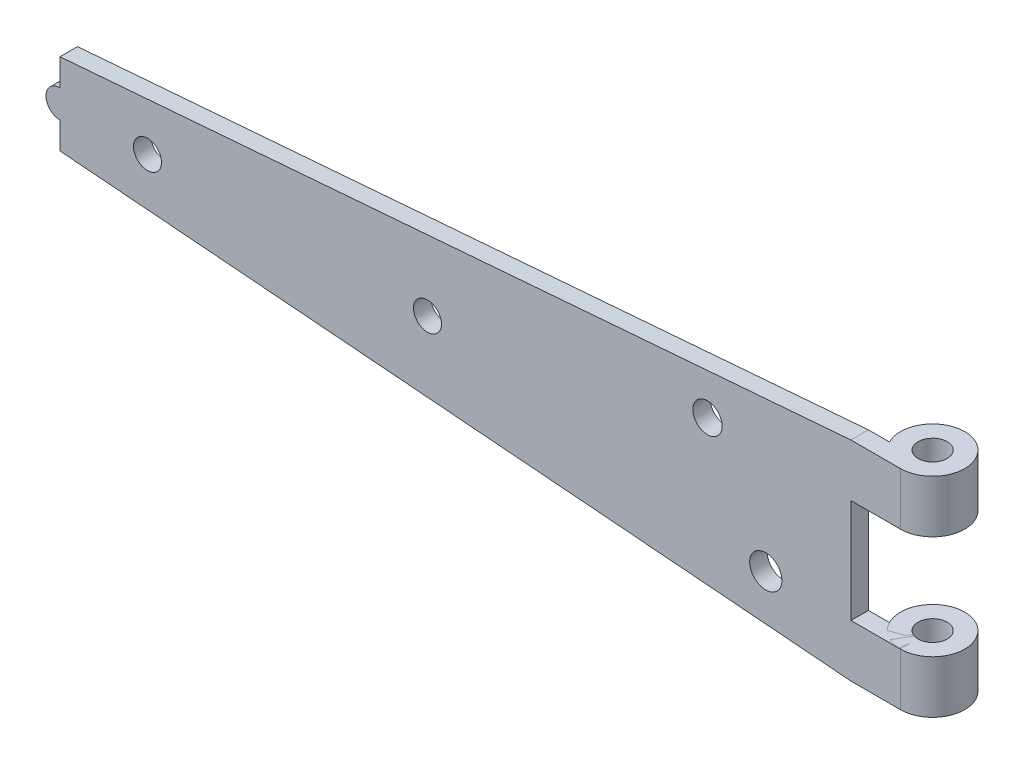
ISO-10303-21;
HEADER;
FILE_DESCRIPTION(('STEP AP214'),'2;1');
FILE_NAME('part.step','',(''),(''),'','','');
FILE_SCHEMA(('AUTOMOTIVE_DESIGN { 1 0 10303 214 1 1 1 1 }'));
ENDSEC;
DATA;
#1=APPLICATION_CONTEXT('core data for automotive mechanical design processes');
#2=APPLICATION_PROTOCOL_DEFINITION('international standard','automotive_design',2000,#1);
#3=PRODUCT_CONTEXT('',#1,'mechanical');
#4=PRODUCT('Part','Part','',(#3));
#5=PRODUCT_RELATED_PRODUCT_CATEGORY('part','',(#4));
#6=PRODUCT_DEFINITION_FORMATION('','',#4);
#7=PRODUCT_DEFINITION_CONTEXT('part definition',#1,'design');
#8=PRODUCT_DEFINITION('design','',#6,#7);
#9=PRODUCT_DEFINITION_SHAPE('','',#8);
#10=(LENGTH_UNIT() NAMED_UNIT(*) SI_UNIT(.MILLI.,.METRE.));
#11=(NAMED_UNIT(*) PLANE_ANGLE_UNIT() SI_UNIT($,.RADIAN.));
#12=(NAMED_UNIT(*) SI_UNIT($,.STERADIAN.) SOLID_ANGLE_UNIT());
#13=UNCERTAINTY_MEASURE_WITH_UNIT(LENGTH_MEASURE(1.E-05),#10,'distance_accuracy_value','');
#14=(GEOMETRIC_REPRESENTATION_CONTEXT(3) GLOBAL_UNCERTAINTY_ASSIGNED_CONTEXT((#13)) GLOBAL_UNIT_ASSIGNED_CONTEXT((#10,
#11,#12)) REPRESENTATION_CONTEXT('',''));
#15=CARTESIAN_POINT('',(0.,0.,0.));
#16=DIRECTION('',(0.,0.,1.));
#17=DIRECTION('',(1.,0.,0.));
#18=AXIS2_PLACEMENT_3D('',#15,#16,#17);
#19=CARTESIAN_POINT('',(8.49999999999998,0.,-2.5));
#20=DIRECTION('',(0.,1.,0.));
#21=DIRECTION('',(0.,0.,1.));
#22=AXIS2_PLACEMENT_3D('',#19,#20,#21);
#23=PLANE('',#22);
#24=CARTESIAN_POINT('',(8.49999999999998,0.,-2.5));
#25=DIRECTION('',(0.,1.,0.));
#26=DIRECTION('',(0.,0.,1.));
#27=AXIS2_PLACEMENT_3D('',#24,#25,#26);
#28=CIRCLE('',#27,2.5);
#29=CARTESIAN_POINT('',(8.49999999999998,0.,0.));
#30=VERTEX_POINT('',#29);
#31=EDGE_CURVE('E64',#30,#30,#28,.T.);
#32=ORIENTED_EDGE('',*,*,#31,.T.);
#33=EDGE_LOOP('',(#32));
#34=FACE_BOUND('',#33,.T.);
#35=CARTESIAN_POINT('',(8.49999999999998,0.,-2.5));
#36=DIRECTION('',(0.,1.,0.));
#37=DIRECTION('',(0.,0.,1.));
#38=AXIS2_PLACEMENT_3D('',#35,#36,#37);
#39=CIRCLE('',#38,5.5);
#40=CARTESIAN_POINT('',(8.49999999999998,0.,3.));
#41=VERTEX_POINT('',#40);
#42=EDGE_CURVE('E60',#41,#41,#39,.T.);
#43=ORIENTED_EDGE('',*,*,#42,.F.);
#44=EDGE_LOOP('',(#43));
#45=FACE_BOUND('',#44,.T.);
#46=ADVANCED_FACE('F47',(#34,#45),#23,.F.);
#47=CARTESIAN_POINT('',(8.49999999999998,24.556349186104,-2.5));
#48=DIRECTION('',(0.,-1.,0.));
#49=DIRECTION('',(0.,0.,-1.));
#50=AXIS2_PLACEMENT_3D('',#47,#48,#49);
#51=CYLINDRICAL_SURFACE('',#50,5.5);
#52=CARTESIAN_POINT('',(8.49999999999998,9.,-2.5));
#53=DIRECTION('',(0.,-1.,0.));
#54=DIRECTION('',(0.,0.,-1.));
#55=AXIS2_PLACEMENT_3D('',#52,#53,#54);
#56=CIRCLE('',#55,5.5);
#57=CARTESIAN_POINT('',(8.49999999999998,9.,-8.));
#58=VERTEX_POINT('',#57);
#59=EDGE_CURVE('E11',#58,#58,#56,.T.);
#60=ORIENTED_EDGE('',*,*,#59,.T.);
#61=EDGE_LOOP('',(#60));
#62=FACE_BOUND('',#61,.T.);
#63=ORIENTED_EDGE('',*,*,#42,.T.);
#64=EDGE_LOOP('',(#63));
#65=FACE_BOUND('',#64,.T.);
#66=ADVANCED_FACE('F51',(#62,#65),#51,.T.);
#67=CARTESIAN_POINT('',(0.,9.,3.));
#68=DIRECTION('',(0.,-1.,0.));
#69=DIRECTION('',(0.,0.,-1.));
#70=AXIS2_PLACEMENT_3D('',#67,#68,#69);
#71=PLANE('',#70);
#72=CARTESIAN_POINT('',(8.49999999999998,8.99999999999999,-2.5));
#73=DIRECTION('',(0.,-1.,0.));
#74=DIRECTION('',(0.,0.,-1.));
#75=AXIS2_PLACEMENT_3D('',#72,#73,#74);
#76=CIRCLE('',#75,2.5);
#77=CARTESIAN_POINT('',(8.49999999999998,8.99999999999999,-5.));
#78=VERTEX_POINT('',#77);
#79=EDGE_CURVE('E52',#78,#78,#76,.F.);
#80=ORIENTED_EDGE('',*,*,#79,.F.);
#81=EDGE_LOOP('',(#80));
#82=FACE_BOUND('',#81,.T.);
#83=ORIENTED_EDGE('',*,*,#59,.F.);
#84=EDGE_LOOP('',(#83));
#85=FACE_BOUND('',#84,.T.);
#86=ADVANCED_FACE('F74',(#82,#85),#71,.F.);
#87=CARTESIAN_POINT('',(8.49999999999998,35.8,-2.5));
#88=DIRECTION('',(0.,-1.,0.));
#89=DIRECTION('',(0.,0.,-1.));
#90=AXIS2_PLACEMENT_3D('',#87,#88,#89);
#91=CYLINDRICAL_SURFACE('',#90,2.5);
#92=ORIENTED_EDGE('',*,*,#31,.F.);
#93=EDGE_LOOP('',(#92));
#94=FACE_BOUND('',#93,.T.);
#95=ORIENTED_EDGE('',*,*,#79,.T.);
#96=EDGE_LOOP('',(#95));
#97=FACE_BOUND('',#96,.T.);
#98=ADVANCED_FACE('F66',(#94,#97),#91,.F.);
#99=CLOSED_SHELL('',(#46,#66,#86,#98));
#100=MANIFOLD_SOLID_BREP('B2',#99);
#101=CARTESIAN_POINT('',(-135.6,17.9,0.));
#102=DIRECTION('',(0.,0.,1.));
#103=DIRECTION('',(1.,0.,0.));
#104=AXIS2_PLACEMENT_3D('',#101,#102,#103);
#105=PLANE('',#104);
#106=CARTESIAN_POINT('',(-14.6,9.,0.));
#107=DIRECTION('',(0.,0.,1.));
#108=DIRECTION('',(1.,0.,0.));
#109=AXIS2_PLACEMENT_3D('',#106,#107,#108);
#110=CIRCLE('',#109,2.7640023032655);
#111=CARTESIAN_POINT('',(-11.8359976967345,9.,0.));
#112=VERTEX_POINT('',#111);
#113=EDGE_CURVE('E392',#112,#112,#110,.T.);
#114=ORIENTED_EDGE('',*,*,#113,.T.);
#115=EDGE_LOOP('',(#114));
#116=FACE_BOUND('',#115,.T.);
#117=CARTESIAN_POINT('',(-24.6,26.8,0.));
#118=DIRECTION('',(0.,0.,1.));
#119=DIRECTION('',(1.,0.,0.));
#120=AXIS2_PLACEMENT_3D('',#117,#118,#119);
#121=CIRCLE('',#120,2.51500077392616);
#122=CARTESIAN_POINT('',(-22.0849992260738,26.8,0.));
#123=VERTEX_POINT('',#122);
#124=EDGE_CURVE('E391',#123,#123,#121,.T.);
#125=ORIENTED_EDGE('',*,*,#124,.T.);
#126=EDGE_LOOP('',(#125));
#127=FACE_BOUND('',#126,.T.);
#128=CARTESIAN_POINT('',(-72.6,17.9,0.));
#129=DIRECTION('',(0.,0.,1.));
#130=DIRECTION('',(1.,0.,0.));
#131=AXIS2_PLACEMENT_3D('',#128,#129,#130);
#132=CIRCLE('',#131,2.4);
#133=CARTESIAN_POINT('',(-70.2,17.9,0.));
#134=VERTEX_POINT('',#133);
#135=EDGE_CURVE('E398',#134,#134,#132,.T.);
#136=ORIENTED_EDGE('',*,*,#135,.T.);
#137=EDGE_LOOP('',(#136));
#138=FACE_BOUND('',#137,.T.);
#139=CARTESIAN_POINT('',(-120.6,17.9,0.));
#140=DIRECTION('',(0.,0.,1.));
#141=DIRECTION('',(1.,0.,0.));
#142=AXIS2_PLACEMENT_3D('',#139,#140,#141);
#143=CIRCLE('',#142,2.4);
#144=CARTESIAN_POINT('',(-118.2,17.9,0.));
#145=VERTEX_POINT('',#144);
#146=EDGE_CURVE('E407',#145,#145,#143,.T.);
#147=ORIENTED_EDGE('',*,*,#146,.T.);
#148=EDGE_LOOP('',(#147));
#149=FACE_BOUND('',#148,.T.);
#150=DIRECTION('',(0.,-1.,0.));
#151=VECTOR('',#150,1.);
#152=CARTESIAN_POINT('',(3.60102051443362,51.356349186104,0.));
#153=LINE('',#152,#151);
#154=CARTESIAN_POINT('',(3.60102051443362,26.8,0.));
#155=VERTEX_POINT('',#154);
#156=CARTESIAN_POINT('',(3.60102051443362,35.8,0.));
#157=VERTEX_POINT('',#156);
#158=EDGE_CURVE('E389',#155,#157,#153,.F.);
#159=ORIENTED_EDGE('',*,*,#158,.F.);
#160=DIRECTION('',(1.,0.,0.));
#161=VECTOR('',#160,1.);
#162=CARTESIAN_POINT('',(0.,26.8,0.));
#163=LINE('',#162,#161);
#164=CARTESIAN_POINT('',(0.,26.8,0.));
#165=VERTEX_POINT('',#164);
#166=EDGE_CURVE('E239',#165,#155,#163,.T.);
#167=ORIENTED_EDGE('',*,*,#166,.F.);
#168=DIRECTION('',(0.,1.,0.));
#169=VECTOR('',#168,1.);
#170=CARTESIAN_POINT('',(0.,26.8,0.));
#171=LINE('',#170,#169);
#172=CARTESIAN_POINT('',(0.,9.,0.));
#173=VERTEX_POINT('',#172);
#174=EDGE_CURVE('E238',#173,#165,#171,.T.);
#175=ORIENTED_EDGE('',*,*,#174,.F.);
#176=DIRECTION('',(-1.,0.,0.));
#177=VECTOR('',#176,1.);
#178=CARTESIAN_POINT('',(0.,9.,0.));
#179=LINE('',#178,#177);
#180=CARTESIAN_POINT('',(8.44996691790585,9.,0.));
#181=VERTEX_POINT('',#180);
#182=EDGE_CURVE('E236',#181,#173,#179,.T.);
#183=ORIENTED_EDGE('',*,*,#182,.F.);
#184=DIRECTION('',(0.,1.,0.));
#185=VECTOR('',#184,1.);
#186=CARTESIAN_POINT('',(8.44996691790585,0.,0.));
#187=LINE('',#186,#185);
#188=CARTESIAN_POINT('',(8.44996691790585,0.,0.));
#189=VERTEX_POINT('',#188);
#190=EDGE_CURVE('E231',#189,#181,#187,.T.);
#191=ORIENTED_EDGE('',*,*,#190,.F.);
#192=DIRECTION('',(1.,0.,0.));
#193=VECTOR('',#192,1.);
#194=CARTESIAN_POINT('',(0.,0.,0.));
#195=LINE('',#194,#193);
#196=CARTESIAN_POINT('',(0.,0.,0.));
#197=VERTEX_POINT('',#196);
#198=EDGE_CURVE('E229',#197,#189,#195,.T.);
#199=ORIENTED_EDGE('',*,*,#198,.F.);
#200=DIRECTION('',(0.996784820812194,-0.0801250335313636,0.));
#201=VECTOR('',#200,1.);
#202=CARTESIAN_POINT('',(0.,0.,0.));
#203=LINE('',#202,#201);
#204=CARTESIAN_POINT('',(-135.6,10.9,0.));
#205=VERTEX_POINT('',#204);
#206=EDGE_CURVE('E167',#205,#197,#203,.T.);
#207=ORIENTED_EDGE('',*,*,#206,.F.);
#208=DIRECTION('',(0.,-1.,0.));
#209=VECTOR('',#208,1.);
#210=CARTESIAN_POINT('',(-135.6,10.9,0.));
#211=LINE('',#210,#209);
#212=CARTESIAN_POINT('',(-135.6,15.5,0.));
#213=VERTEX_POINT('',#212);
#214=EDGE_CURVE('E165',#213,#205,#211,.T.);
#215=ORIENTED_EDGE('',*,*,#214,.F.);
#216=CARTESIAN_POINT('',(-135.6,17.9,0.));
#217=DIRECTION('',(0.,0.,1.));
#218=DIRECTION('',(1.,0.,0.));
#219=AXIS2_PLACEMENT_3D('',#216,#217,#218);
#220=CIRCLE('',#219,2.4);
#221=CARTESIAN_POINT('',(-135.6,20.3,0.));
#222=VERTEX_POINT('',#221);
#223=EDGE_CURVE('E216',#222,#213,#220,.T.);
#224=ORIENTED_EDGE('',*,*,#223,.F.);
#225=DIRECTION('',(0.,-1.,0.));
#226=VECTOR('',#225,1.);
#227=CARTESIAN_POINT('',(-135.6,20.3,0.));
#228=LINE('',#227,#226);
#229=CARTESIAN_POINT('',(-135.6,24.9,0.));
#230=VERTEX_POINT('',#229);
#231=EDGE_CURVE('E250',#230,#222,#228,.T.);
#232=ORIENTED_EDGE('',*,*,#231,.F.);
#233=DIRECTION('',(-0.996784820812194,-0.0801250335313637,0.));
#234=VECTOR('',#233,1.);
#235=CARTESIAN_POINT('',(-135.6,24.9,0.));
#236=LINE('',#235,#234);
#237=CARTESIAN_POINT('',(0.,35.8,0.));
#238=VERTEX_POINT('',#237);
#239=EDGE_CURVE('E244',#238,#230,#236,.T.);
#240=ORIENTED_EDGE('',*,*,#239,.F.);
#241=DIRECTION('',(-1.,0.,0.));
#242=VECTOR('',#241,1.);
#243=CARTESIAN_POINT('',(0.,35.8,0.));
#244=LINE('',#243,#242);
#245=EDGE_CURVE('E243',#157,#238,#244,.T.);
#246=ORIENTED_EDGE('',*,*,#245,.F.);
#247=EDGE_LOOP('',(#159,#167,#175,#183,#191,#199,#207,#215,#224,#232,#240,#246));
#248=FACE_BOUND('',#247,.T.);
#249=ADVANCED_FACE('F111',(#116,#127,#138,#149,#248),#105,.F.);
#250=CARTESIAN_POINT('',(8.44996691790585,35.8,3.));
#251=DIRECTION('',(-1.,0.,0.));
#252=DIRECTION('',(0.,0.,1.));
#253=AXIS2_PLACEMENT_3D('',#250,#251,#252);
#254=PLANE('',#253);
#255=DIRECTION('',(0.,-1.,0.));
#256=VECTOR('',#255,1.);
#257=CARTESIAN_POINT('',(8.44996691790585,51.356349186104,2.99977242171857));
#258=LINE('',#257,#256);
#259=CARTESIAN_POINT('',(8.44996691790585,35.8,2.99977242171857));
#260=VERTEX_POINT('',#259);
#261=CARTESIAN_POINT('',(8.44996691790585,26.8,2.99977242171857));
#262=VERTEX_POINT('',#261);
#263=EDGE_CURVE('E383',#260,#262,#258,.T.);
#264=ORIENTED_EDGE('',*,*,#263,.F.);
#265=DIRECTION('',(0.,0.,-1.));
#266=VECTOR('',#265,1.);
#267=CARTESIAN_POINT('',(8.44996691790585,35.8,3.));
#268=LINE('',#267,#266);
#269=CARTESIAN_POINT('',(8.44996691790585,35.8,3.));
#270=VERTEX_POINT('',#269);
#271=EDGE_CURVE('E265',#270,#260,#268,.T.);
#272=ORIENTED_EDGE('',*,*,#271,.F.);
#273=DIRECTION('',(0.,1.,0.));
#274=VECTOR('',#273,1.);
#275=CARTESIAN_POINT('',(8.44996691790585,35.8,3.));
#276=LINE('',#275,#274);
#277=CARTESIAN_POINT('',(8.44996691790585,26.8,3.));
#278=VERTEX_POINT('',#277);
#279=EDGE_CURVE('E300',#278,#270,#276,.T.);
#280=ORIENTED_EDGE('',*,*,#279,.F.);
#281=DIRECTION('',(0.,0.,-1.));
#282=VECTOR('',#281,1.);
#283=CARTESIAN_POINT('',(8.44996691790585,26.8,3.));
#284=LINE('',#283,#282);
#285=EDGE_CURVE('E261',#278,#262,#284,.T.);
#286=ORIENTED_EDGE('',*,*,#285,.T.);
#287=EDGE_LOOP('',(#264,#272,#280,#286));
#288=FACE_BOUND('',#287,.T.);
#289=ADVANCED_FACE('F331',(#288),#254,.F.);
#290=CARTESIAN_POINT('',(-135.6,17.9,3.));
#291=DIRECTION('',(0.,0.,1.));
#292=DIRECTION('',(1.,0.,0.));
#293=AXIS2_PLACEMENT_3D('',#290,#291,#292);
#294=PLANE('',#293);
#295=CARTESIAN_POINT('',(-24.6,26.8,3.));
#296=DIRECTION('',(0.,0.,1.));
#297=DIRECTION('',(1.,0.,0.));
#298=AXIS2_PLACEMENT_3D('',#295,#296,#297);
#299=CIRCLE('',#298,2.51500077392616);
#300=CARTESIAN_POINT('',(-22.0849992260738,26.8,3.));
#301=VERTEX_POINT('',#300);
#302=EDGE_CURVE('E399',#301,#301,#299,.T.);
#303=ORIENTED_EDGE('',*,*,#302,.F.);
#304=EDGE_LOOP('',(#303));
#305=FACE_BOUND('',#304,.T.);
#306=CARTESIAN_POINT('',(-120.6,17.9,3.));
#307=DIRECTION('',(0.,0.,1.));
#308=DIRECTION('',(1.,0.,0.));
#309=AXIS2_PLACEMENT_3D('',#306,#307,#308);
#310=CIRCLE('',#309,2.4);
#311=CARTESIAN_POINT('',(-118.2,17.9,3.));
#312=VERTEX_POINT('',#311);
#313=EDGE_CURVE('E234',#312,#312,#310,.T.);
#314=ORIENTED_EDGE('',*,*,#313,.F.);
#315=EDGE_LOOP('',(#314));
#316=FACE_BOUND('',#315,.T.);
#317=DIRECTION('',(1.,0.,0.));
#318=VECTOR('',#317,1.);
#319=CARTESIAN_POINT('',(0.,0.,3.));
#320=LINE('',#319,#318);
#321=CARTESIAN_POINT('',(0.,0.,3.));
#322=VERTEX_POINT('',#321);
#323=CARTESIAN_POINT('',(8.44996691790585,0.,3.));
#324=VERTEX_POINT('',#323);
#325=EDGE_CURVE('E255',#322,#324,#320,.T.);
#326=ORIENTED_EDGE('',*,*,#325,.T.);
#327=DIRECTION('',(0.,1.,0.));
#328=VECTOR('',#327,1.);
#329=CARTESIAN_POINT('',(8.44996691790585,0.,3.));
#330=LINE('',#329,#328);
#331=CARTESIAN_POINT('',(8.44996691790585,9.,3.));
#332=VERTEX_POINT('',#331);
#333=EDGE_CURVE('E178',#324,#332,#330,.T.);
#334=ORIENTED_EDGE('',*,*,#333,.T.);
#335=DIRECTION('',(-1.,0.,0.));
#336=VECTOR('',#335,1.);
#337=CARTESIAN_POINT('',(0.,9.,3.));
#338=LINE('',#337,#336);
#339=CARTESIAN_POINT('',(0.,9.,3.));
#340=VERTEX_POINT('',#339);
#341=EDGE_CURVE('E276',#332,#340,#338,.T.);
#342=ORIENTED_EDGE('',*,*,#341,.T.);
#343=DIRECTION('',(0.,1.,0.));
#344=VECTOR('',#343,1.);
#345=CARTESIAN_POINT('',(0.,26.8,3.));
#346=LINE('',#345,#344);
#347=CARTESIAN_POINT('',(0.,26.8,3.));
#348=VERTEX_POINT('',#347);
#349=EDGE_CURVE('E296',#340,#348,#346,.T.);
#350=ORIENTED_EDGE('',*,*,#349,.T.);
#351=DIRECTION('',(1.,0.,0.));
#352=VECTOR('',#351,1.);
#353=CARTESIAN_POINT('',(0.,26.8,3.));
#354=LINE('',#353,#352);
#355=EDGE_CURVE('E294',#348,#278,#354,.T.);
#356=ORIENTED_EDGE('',*,*,#355,.T.);
#357=ORIENTED_EDGE('',*,*,#279,.T.);
#358=DIRECTION('',(-1.,0.,0.));
#359=VECTOR('',#358,1.);
#360=CARTESIAN_POINT('',(0.,35.8,3.));
#361=LINE('',#360,#359);
#362=CARTESIAN_POINT('',(0.,35.8,3.));
#363=VERTEX_POINT('',#362);
#364=EDGE_CURVE('E297',#270,#363,#361,.T.);
#365=ORIENTED_EDGE('',*,*,#364,.T.);
#366=DIRECTION('',(-0.996784820812194,-0.0801250335313637,0.));
#367=VECTOR('',#366,1.);
#368=CARTESIAN_POINT('',(-135.6,24.9,3.));
#369=LINE('',#368,#367);
#370=CARTESIAN_POINT('',(-135.6,24.9,3.));
#371=VERTEX_POINT('',#370);
#372=EDGE_CURVE('E306',#363,#371,#369,.T.);
#373=ORIENTED_EDGE('',*,*,#372,.T.);
#374=DIRECTION('',(0.,-1.,0.));
#375=VECTOR('',#374,1.);
#376=CARTESIAN_POINT('',(-135.6,20.3,3.));
#377=LINE('',#376,#375);
#378=CARTESIAN_POINT('',(-135.6,20.3,3.));
#379=VERTEX_POINT('',#378);
#380=EDGE_CURVE('E215',#371,#379,#377,.T.);
#381=ORIENTED_EDGE('',*,*,#380,.T.);
#382=CARTESIAN_POINT('',(-135.6,17.9,3.));
#383=DIRECTION('',(0.,0.,1.));
#384=DIRECTION('',(1.,0.,0.));
#385=AXIS2_PLACEMENT_3D('',#382,#383,#384);
#386=CIRCLE('',#385,2.4);
#387=CARTESIAN_POINT('',(-135.6,15.5,3.));
#388=VERTEX_POINT('',#387);
#389=EDGE_CURVE('E203',#379,#388,#386,.T.);
#390=ORIENTED_EDGE('',*,*,#389,.T.);
#391=DIRECTION('',(0.,-1.,0.));
#392=VECTOR('',#391,1.);
#393=CARTESIAN_POINT('',(-135.6,10.9,3.));
#394=LINE('',#393,#392);
#395=CARTESIAN_POINT('',(-135.6,10.9,3.));
#396=VERTEX_POINT('',#395);
#397=EDGE_CURVE('E208',#388,#396,#394,.T.);
#398=ORIENTED_EDGE('',*,*,#397,.T.);
#399=DIRECTION('',(0.996784820812194,-0.0801250335313636,0.));
#400=VECTOR('',#399,1.);
#401=CARTESIAN_POINT('',(0.,0.,3.));
#402=LINE('',#401,#400);
#403=EDGE_CURVE('E129',#396,#322,#402,.T.);
#404=ORIENTED_EDGE('',*,*,#403,.T.);
#405=EDGE_LOOP('',(#326,#334,#342,#350,#356,#357,#365,#373,#381,#390,#398,#404));
#406=FACE_BOUND('',#405,.T.);
#407=CARTESIAN_POINT('',(-72.6,17.9,3.));
#408=DIRECTION('',(0.,0.,1.));
#409=DIRECTION('',(1.,0.,0.));
#410=AXIS2_PLACEMENT_3D('',#407,#408,#409);
#411=CIRCLE('',#410,2.4);
#412=CARTESIAN_POINT('',(-70.2,17.9,3.));
#413=VERTEX_POINT('',#412);
#414=EDGE_CURVE('E401',#413,#413,#411,.T.);
#415=ORIENTED_EDGE('',*,*,#414,.F.);
#416=EDGE_LOOP('',(#415));
#417=FACE_BOUND('',#416,.T.);
#418=CARTESIAN_POINT('',(-14.6,9.,3.));
#419=DIRECTION('',(0.,0.,1.));
#420=DIRECTION('',(1.,0.,0.));
#421=AXIS2_PLACEMENT_3D('',#418,#419,#420);
#422=CIRCLE('',#421,2.7640023032655);
#423=CARTESIAN_POINT('',(-11.8359976967345,9.,3.));
#424=VERTEX_POINT('',#423);
#425=EDGE_CURVE('E395',#424,#424,#422,.T.);
#426=ORIENTED_EDGE('',*,*,#425,.F.);
#427=EDGE_LOOP('',(#426));
#428=FACE_BOUND('',#427,.T.);
#429=ADVANCED_FACE('F210',(#305,#316,#406,#417,#428),#294,.T.);
#430=CARTESIAN_POINT('',(0.,0.,3.));
#431=DIRECTION('',(0.,1.,0.));
#432=DIRECTION('',(0.,0.,1.));
#433=AXIS2_PLACEMENT_3D('',#430,#431,#432);
#434=PLANE('',#433);
#435=ORIENTED_EDGE('',*,*,#198,.T.);
#436=DIRECTION('',(0.,0.,-1.));
#437=VECTOR('',#436,1.);
#438=CARTESIAN_POINT('',(8.44996691790585,0.,3.));
#439=LINE('',#438,#437);
#440=EDGE_CURVE('E50',#324,#189,#439,.T.);
#441=ORIENTED_EDGE('',*,*,#440,.F.);
#442=ORIENTED_EDGE('',*,*,#325,.F.);
#443=DIRECTION('',(0.,0.,-1.));
#444=VECTOR('',#443,1.);
#445=CARTESIAN_POINT('',(0.,0.,3.));
#446=LINE('',#445,#444);
#447=EDGE_CURVE('E228',#322,#197,#446,.T.);
#448=ORIENTED_EDGE('',*,*,#447,.T.);
#449=EDGE_LOOP('',(#435,#441,#442,#448));
#450=FACE_BOUND('',#449,.T.);
#451=ADVANCED_FACE('F113',(#450),#434,.F.);
#452=CARTESIAN_POINT('',(8.44996691790585,0.,3.));
#453=DIRECTION('',(-1.,0.,0.));
#454=DIRECTION('',(0.,0.,1.));
#455=AXIS2_PLACEMENT_3D('',#452,#453,#454);
#456=PLANE('',#455);
#457=ORIENTED_EDGE('',*,*,#190,.T.);
#458=DIRECTION('',(0.,0.,-1.));
#459=VECTOR('',#458,1.);
#460=CARTESIAN_POINT('',(8.44996691790585,9.,3.));
#461=LINE('',#460,#459);
#462=EDGE_CURVE('E119',#332,#181,#461,.T.);
#463=ORIENTED_EDGE('',*,*,#462,.F.);
#464=ORIENTED_EDGE('',*,*,#333,.F.);
#465=ORIENTED_EDGE('',*,*,#440,.T.);
#466=EDGE_LOOP('',(#457,#463,#464,#465));
#467=FACE_BOUND('',#466,.T.);
#468=ADVANCED_FACE('F454',(#467),#456,.F.);
#469=CARTESIAN_POINT('',(0.,9.,3.));
#470=DIRECTION('',(0.,-1.,0.));
#471=DIRECTION('',(0.,0.,-1.));
#472=AXIS2_PLACEMENT_3D('',#469,#470,#471);
#473=PLANE('',#472);
#474=ORIENTED_EDGE('',*,*,#182,.T.);
#475=DIRECTION('',(0.,0.,-1.));
#476=VECTOR('',#475,1.);
#477=CARTESIAN_POINT('',(0.,9.,3.));
#478=LINE('',#477,#476);
#479=EDGE_CURVE('E272',#340,#173,#478,.T.);
#480=ORIENTED_EDGE('',*,*,#479,.F.);
#481=ORIENTED_EDGE('',*,*,#341,.F.);
#482=ORIENTED_EDGE('',*,*,#462,.T.);
#483=EDGE_LOOP('',(#474,#480,#481,#482));
#484=FACE_BOUND('',#483,.T.);
#485=ADVANCED_FACE('F280',(#484),#473,.F.);
#486=CARTESIAN_POINT('',(0.,26.8,3.));
#487=DIRECTION('',(-1.,0.,0.));
#488=DIRECTION('',(0.,0.,1.));
#489=AXIS2_PLACEMENT_3D('',#486,#487,#488);
#490=PLANE('',#489);
#491=ORIENTED_EDGE('',*,*,#174,.T.);
#492=DIRECTION('',(0.,0.,-1.));
#493=VECTOR('',#492,1.);
#494=CARTESIAN_POINT('',(0.,26.8,3.));
#495=LINE('',#494,#493);
#496=EDGE_CURVE('E270',#348,#165,#495,.T.);
#497=ORIENTED_EDGE('',*,*,#496,.F.);
#498=ORIENTED_EDGE('',*,*,#349,.F.);
#499=ORIENTED_EDGE('',*,*,#479,.T.);
#500=EDGE_LOOP('',(#491,#497,#498,#499));
#501=FACE_BOUND('',#500,.T.);
#502=ADVANCED_FACE('F289',(#501),#490,.F.);
#503=CARTESIAN_POINT('',(0.,26.8,3.));
#504=DIRECTION('',(0.,1.,0.));
#505=DIRECTION('',(0.,0.,1.));
#506=AXIS2_PLACEMENT_3D('',#503,#504,#505);
#507=PLANE('',#506);
#508=CARTESIAN_POINT('',(8.49999999999998,26.8,-2.5));
#509=DIRECTION('',(0.,1.,0.));
#510=DIRECTION('',(0.,0.,1.));
#511=AXIS2_PLACEMENT_3D('',#508,#509,#510);
#512=CIRCLE('',#511,2.5);
#513=CARTESIAN_POINT('',(8.49999999999998,26.8,0.));
#514=VERTEX_POINT('',#513);
#515=EDGE_CURVE('E372',#514,#514,#512,.F.);
#516=ORIENTED_EDGE('',*,*,#515,.F.);
#517=EDGE_LOOP('',(#516));
#518=FACE_BOUND('',#517,.T.);
#519=ORIENTED_EDGE('',*,*,#166,.T.);
#520=CARTESIAN_POINT('',(8.49999999999998,26.8,-2.5));
#521=DIRECTION('',(0.,1.,0.));
#522=DIRECTION('',(0.,0.,1.));
#523=AXIS2_PLACEMENT_3D('',#520,#521,#522);
#524=CIRCLE('',#523,5.5);
#525=EDGE_CURVE('E376',#262,#155,#524,.T.);
#526=ORIENTED_EDGE('',*,*,#525,.F.);
#527=ORIENTED_EDGE('',*,*,#285,.F.);
#528=ORIENTED_EDGE('',*,*,#355,.F.);
#529=ORIENTED_EDGE('',*,*,#496,.T.);
#530=EDGE_LOOP('',(#519,#526,#527,#528,#529));
#531=FACE_BOUND('',#530,.T.);
#532=ADVANCED_FACE('F293',(#518,#531),#507,.F.);
#533=CARTESIAN_POINT('',(0.,35.8,3.));
#534=DIRECTION('',(0.,-1.,0.));
#535=DIRECTION('',(0.,0.,-1.));
#536=AXIS2_PLACEMENT_3D('',#533,#534,#535);
#537=PLANE('',#536);
#538=CARTESIAN_POINT('',(8.49999999999998,35.8,-2.5));
#539=DIRECTION('',(0.,1.,0.));
#540=DIRECTION('',(0.,0.,1.));
#541=AXIS2_PLACEMENT_3D('',#538,#539,#540);
#542=CIRCLE('',#541,2.5);
#543=CARTESIAN_POINT('',(8.49999999999998,35.8,0.));
#544=VERTEX_POINT('',#543);
#545=EDGE_CURVE('E371',#544,#544,#542,.T.);
#546=ORIENTED_EDGE('',*,*,#545,.F.);
#547=EDGE_LOOP('',(#546));
#548=FACE_BOUND('',#547,.T.);
#549=CARTESIAN_POINT('',(8.49999999999998,35.8,-2.5));
#550=DIRECTION('',(0.,-1.,0.));
#551=DIRECTION('',(0.,0.,-1.));
#552=AXIS2_PLACEMENT_3D('',#549,#550,#551);
#553=CIRCLE('',#552,5.5);
#554=EDGE_CURVE('E378',#157,#260,#553,.T.);
#555=ORIENTED_EDGE('',*,*,#554,.F.);
#556=ORIENTED_EDGE('',*,*,#245,.T.);
#557=DIRECTION('',(0.,0.,-1.));
#558=VECTOR('',#557,1.);
#559=CARTESIAN_POINT('',(0.,35.8,3.));
#560=LINE('',#559,#558);
#561=EDGE_CURVE('E256',#363,#238,#560,.T.);
#562=ORIENTED_EDGE('',*,*,#561,.F.);
#563=ORIENTED_EDGE('',*,*,#364,.F.);
#564=ORIENTED_EDGE('',*,*,#271,.T.);
#565=EDGE_LOOP('',(#555,#556,#562,#563,#564));
#566=FACE_BOUND('',#565,.T.);
#567=ADVANCED_FACE('F440',(#548,#566),#537,.F.);
#568=CARTESIAN_POINT('',(-135.6,24.9,3.));
#569=DIRECTION('',(0.0801250335313637,-0.996784820812194,0.));
#570=DIRECTION('',(0.996784820812194,0.0801250335313637,0.));
#571=AXIS2_PLACEMENT_3D('',#568,#569,#570);
#572=PLANE('',#571);
#573=ORIENTED_EDGE('',*,*,#239,.T.);
#574=DIRECTION('',(0.,0.,-1.));
#575=VECTOR('',#574,1.);
#576=CARTESIAN_POINT('',(-135.6,24.9,3.));
#577=LINE('',#576,#575);
#578=EDGE_CURVE('E257',#371,#230,#577,.T.);
#579=ORIENTED_EDGE('',*,*,#578,.F.);
#580=ORIENTED_EDGE('',*,*,#372,.F.);
#581=ORIENTED_EDGE('',*,*,#561,.T.);
#582=EDGE_LOOP('',(#573,#579,#580,#581));
#583=FACE_BOUND('',#582,.T.);
#584=ADVANCED_FACE('F315',(#583),#572,.F.);
#585=CARTESIAN_POINT('',(-135.6,20.3,3.));
#586=DIRECTION('',(1.,0.,0.));
#587=DIRECTION('',(0.,1.,0.));
#588=AXIS2_PLACEMENT_3D('',#585,#586,#587);
#589=PLANE('',#588);
#590=ORIENTED_EDGE('',*,*,#231,.T.);
#591=DIRECTION('',(0.,0.,-1.));
#592=VECTOR('',#591,1.);
#593=CARTESIAN_POINT('',(-135.6,20.3,3.));
#594=LINE('',#593,#592);
#595=EDGE_CURVE('E222',#379,#222,#594,.T.);
#596=ORIENTED_EDGE('',*,*,#595,.F.);
#597=ORIENTED_EDGE('',*,*,#380,.F.);
#598=ORIENTED_EDGE('',*,*,#578,.T.);
#599=EDGE_LOOP('',(#590,#596,#597,#598));
#600=FACE_BOUND('',#599,.T.);
#601=ADVANCED_FACE('F317',(#600),#589,.F.);
#602=CARTESIAN_POINT('',(-135.6,17.9,3.));
#603=DIRECTION('',(0.,0.,-1.));
#604=DIRECTION('',(-1.,0.,0.));
#605=AXIS2_PLACEMENT_3D('',#602,#603,#604);
#606=CYLINDRICAL_SURFACE('',#605,2.4);
#607=ORIENTED_EDGE('',*,*,#223,.T.);
#608=DIRECTION('',(0.,0.,-1.));
#609=VECTOR('',#608,1.);
#610=CARTESIAN_POINT('',(-135.6,15.5,3.));
#611=LINE('',#610,#609);
#612=EDGE_CURVE('E220',#388,#213,#611,.T.);
#613=ORIENTED_EDGE('',*,*,#612,.F.);
#614=ORIENTED_EDGE('',*,*,#389,.F.);
#615=ORIENTED_EDGE('',*,*,#595,.T.);
#616=EDGE_LOOP('',(#607,#613,#614,#615));
#617=FACE_BOUND('',#616,.T.);
#618=ADVANCED_FACE('F218',(#617),#606,.T.);
#619=CARTESIAN_POINT('',(-135.6,10.9,3.));
#620=DIRECTION('',(1.,0.,0.));
#621=DIRECTION('',(0.,1.,0.));
#622=AXIS2_PLACEMENT_3D('',#619,#620,#621);
#623=PLANE('',#622);
#624=ORIENTED_EDGE('',*,*,#214,.T.);
#625=DIRECTION('',(0.,0.,-1.));
#626=VECTOR('',#625,1.);
#627=CARTESIAN_POINT('',(-135.6,10.9,3.));
#628=LINE('',#627,#626);
#629=EDGE_CURVE('E224',#396,#205,#628,.T.);
#630=ORIENTED_EDGE('',*,*,#629,.F.);
#631=ORIENTED_EDGE('',*,*,#397,.F.);
#632=ORIENTED_EDGE('',*,*,#612,.T.);
#633=EDGE_LOOP('',(#624,#630,#631,#632));
#634=FACE_BOUND('',#633,.T.);
#635=ADVANCED_FACE('F221',(#634),#623,.F.);
#636=CARTESIAN_POINT('',(0.,0.,3.));
#637=DIRECTION('',(0.0801250335313636,0.996784820812194,0.));
#638=DIRECTION('',(-0.996784820812194,0.0801250335313636,0.));
#639=AXIS2_PLACEMENT_3D('',#636,#637,#638);
#640=PLANE('',#639);
#641=ORIENTED_EDGE('',*,*,#206,.T.);
#642=ORIENTED_EDGE('',*,*,#447,.F.);
#643=ORIENTED_EDGE('',*,*,#403,.F.);
#644=ORIENTED_EDGE('',*,*,#629,.T.);
#645=EDGE_LOOP('',(#641,#642,#643,#644));
#646=FACE_BOUND('',#645,.T.);
#647=ADVANCED_FACE('F318',(#646),#640,.F.);
#648=CARTESIAN_POINT('',(-120.6,17.9,3.));
#649=DIRECTION('',(0.,0.,-1.));
#650=DIRECTION('',(-1.,0.,0.));
#651=AXIS2_PLACEMENT_3D('',#648,#649,#650);
#652=CYLINDRICAL_SURFACE('',#651,2.4);
#653=ORIENTED_EDGE('',*,*,#313,.T.);
#654=EDGE_LOOP('',(#653));
#655=FACE_BOUND('',#654,.T.);
#656=ORIENTED_EDGE('',*,*,#146,.F.);
#657=EDGE_LOOP('',(#656));
#658=FACE_BOUND('',#657,.T.);
#659=ADVANCED_FACE('F325',(#655,#658),#652,.F.);
#660=CARTESIAN_POINT('',(-72.6,17.9,3.));
#661=DIRECTION('',(0.,0.,-1.));
#662=DIRECTION('',(-1.,0.,0.));
#663=AXIS2_PLACEMENT_3D('',#660,#661,#662);
#664=CYLINDRICAL_SURFACE('',#663,2.4);
#665=ORIENTED_EDGE('',*,*,#414,.T.);
#666=EDGE_LOOP('',(#665));
#667=FACE_BOUND('',#666,.T.);
#668=ORIENTED_EDGE('',*,*,#135,.F.);
#669=EDGE_LOOP('',(#668));
#670=FACE_BOUND('',#669,.T.);
#671=ADVANCED_FACE('F328',(#667,#670),#664,.F.);
#672=CARTESIAN_POINT('',(-24.6,26.8,3.));
#673=DIRECTION('',(0.,0.,-1.));
#674=DIRECTION('',(-1.,0.,0.));
#675=AXIS2_PLACEMENT_3D('',#672,#673,#674);
#676=CYLINDRICAL_SURFACE('',#675,2.51500077392616);
#677=ORIENTED_EDGE('',*,*,#302,.T.);
#678=EDGE_LOOP('',(#677));
#679=FACE_BOUND('',#678,.T.);
#680=ORIENTED_EDGE('',*,*,#124,.F.);
#681=EDGE_LOOP('',(#680));
#682=FACE_BOUND('',#681,.T.);
#683=ADVANCED_FACE('F346',(#679,#682),#676,.F.);
#684=CARTESIAN_POINT('',(-14.6,9.,3.));
#685=DIRECTION('',(0.,0.,-1.));
#686=DIRECTION('',(-1.,0.,0.));
#687=AXIS2_PLACEMENT_3D('',#684,#685,#686);
#688=CYLINDRICAL_SURFACE('',#687,2.7640023032655);
#689=ORIENTED_EDGE('',*,*,#425,.T.);
#690=EDGE_LOOP('',(#689));
#691=FACE_BOUND('',#690,.T.);
#692=ORIENTED_EDGE('',*,*,#113,.F.);
#693=EDGE_LOOP('',(#692));
#694=FACE_BOUND('',#693,.T.);
#695=ADVANCED_FACE('F351',(#691,#694),#688,.F.);
#696=CARTESIAN_POINT('',(8.49999999999998,51.356349186104,-2.5));
#697=DIRECTION('',(0.,-1.,0.));
#698=DIRECTION('',(0.,0.,-1.));
#699=AXIS2_PLACEMENT_3D('',#696,#697,#698);
#700=CYLINDRICAL_SURFACE('',#699,5.5);
#701=ORIENTED_EDGE('',*,*,#525,.T.);
#702=ORIENTED_EDGE('',*,*,#158,.T.);
#703=ORIENTED_EDGE('',*,*,#554,.T.);
#704=ORIENTED_EDGE('',*,*,#263,.T.);
#705=EDGE_LOOP('',(#701,#702,#703,#704));
#706=FACE_BOUND('',#705,.T.);
#707=ADVANCED_FACE('F357',(#706),#700,.T.);
#708=CARTESIAN_POINT('',(8.49999999999998,35.8,-2.5));
#709=DIRECTION('',(0.,-1.,0.));
#710=DIRECTION('',(0.,0.,-1.));
#711=AXIS2_PLACEMENT_3D('',#708,#709,#710);
#712=CYLINDRICAL_SURFACE('',#711,2.5);
#713=ORIENTED_EDGE('',*,*,#545,.T.);
#714=EDGE_LOOP('',(#713));
#715=FACE_BOUND('',#714,.T.);
#716=ORIENTED_EDGE('',*,*,#515,.T.);
#717=EDGE_LOOP('',(#716));
#718=FACE_BOUND('',#717,.T.);
#719=ADVANCED_FACE('F363',(#715,#718),#712,.F.);
#720=CLOSED_SHELL('',(#249,#289,#429,#451,#468,#485,#502,#532,#567,#584,#601,#618,#635,#647,
#659,#671,#683,#695,#707,#719));
#721=MANIFOLD_SOLID_BREP('B6',#720);
#722=ADVANCED_BREP_SHAPE_REPRESENTATION('',(#18,#100,#721),#14);
#723=SHAPE_DEFINITION_REPRESENTATION(#9,#722);
ENDSEC;
END-ISO-10303-21;
